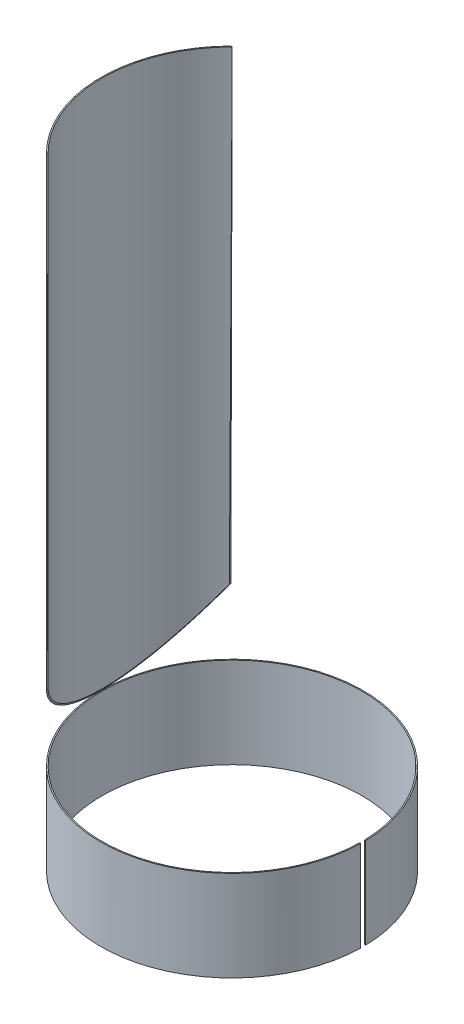
ISO-10303-21;
HEADER;
FILE_DESCRIPTION(('STEP AP214'),'2;1');
FILE_NAME('part.step','',(''),(''),'','','');
FILE_SCHEMA(('AUTOMOTIVE_DESIGN { 1 0 10303 214 1 1 1 1 }'));
ENDSEC;
DATA;
#1=APPLICATION_CONTEXT('core data for automotive mechanical design processes');
#2=APPLICATION_PROTOCOL_DEFINITION('international standard','automotive_design',2000,#1);
#3=PRODUCT_CONTEXT('',#1,'mechanical');
#4=PRODUCT('Part','Part','',(#3));
#5=PRODUCT_RELATED_PRODUCT_CATEGORY('part','',(#4));
#6=PRODUCT_DEFINITION_FORMATION('','',#4);
#7=PRODUCT_DEFINITION_CONTEXT('part definition',#1,'design');
#8=PRODUCT_DEFINITION('design','',#6,#7);
#9=PRODUCT_DEFINITION_SHAPE('','',#8);
#10=(LENGTH_UNIT() NAMED_UNIT(*) SI_UNIT(.MILLI.,.METRE.));
#11=(NAMED_UNIT(*) PLANE_ANGLE_UNIT() SI_UNIT($,.RADIAN.));
#12=(NAMED_UNIT(*) SI_UNIT($,.STERADIAN.) SOLID_ANGLE_UNIT());
#13=UNCERTAINTY_MEASURE_WITH_UNIT(LENGTH_MEASURE(1.E-05),#10,'distance_accuracy_value','');
#14=(GEOMETRIC_REPRESENTATION_CONTEXT(3) GLOBAL_UNCERTAINTY_ASSIGNED_CONTEXT((#13)) GLOBAL_UNIT_ASSIGNED_CONTEXT((#10,
#11,#12)) REPRESENTATION_CONTEXT('',''));
#15=CARTESIAN_POINT('',(0.,0.,0.));
#16=DIRECTION('',(0.,0.,1.));
#17=DIRECTION('',(1.,0.,0.));
#18=AXIS2_PLACEMENT_3D('',#15,#16,#17);
#19=CARTESIAN_POINT('',(0.,270.,0.));
#20=DIRECTION('',(0.,-1.,0.));
#21=DIRECTION('',(0.,0.,-1.));
#22=AXIS2_PLACEMENT_3D('',#19,#20,#21);
#23=CYLINDRICAL_SURFACE('',#22,56.5);
#24=CARTESIAN_POINT('',(0.,13327.2901506706,0.));
#25=DIRECTION('',(-0.999995330481393,0.00305598026980909,0.));
#26=DIRECTION('',(-0.00305598026980909,-0.999995330481393,0.));
#27=AXIS2_PLACEMENT_3D('',#24,#25,#26);
#28=ELLIPSE('',#27,18488.3392599683,56.5);
#29=CARTESIAN_POINT('',(-40.5206535567404,67.8902961925047,39.3741874244361));
#30=VERTEX_POINT('',#29);
#31=CARTESIAN_POINT('',(-39.9030074054575,270.,40.));
#32=VERTEX_POINT('',#31);
#33=EDGE_CURVE('E125',#30,#32,#28,.T.);
#34=ORIENTED_EDGE('',*,*,#33,.F.);
#35=CARTESIAN_POINT('',(0.,138.074126908676,0.));
#36=DIRECTION('',(-0.866025403784439,0.5,0.));
#37=DIRECTION('',(-0.5,-0.866025403784439,0.));
#38=AXIS2_PLACEMENT_3D('',#35,#36,#37);
#39=ELLIPSE('',#38,113.,56.5);
#40=CARTESIAN_POINT('',(-40.5206535567404,67.8902961925047,-39.3741874244361));
#41=VERTEX_POINT('',#40);
#42=EDGE_CURVE('E134',#41,#30,#39,.T.);
#43=ORIENTED_EDGE('',*,*,#42,.F.);
#44=CARTESIAN_POINT('',(-39.9030074054575,270.,-40.));
#45=VERTEX_POINT('',#44);
#46=EDGE_CURVE('E62',#45,#41,#28,.T.);
#47=ORIENTED_EDGE('',*,*,#46,.F.);
#48=CARTESIAN_POINT('',(0.,270.,0.));
#49=DIRECTION('',(0.,1.,0.));
#50=DIRECTION('',(0.,0.,1.));
#51=AXIS2_PLACEMENT_3D('',#48,#49,#50);
#52=CIRCLE('',#51,56.5);
#53=EDGE_CURVE('E132',#45,#32,#52,.T.);
#54=ORIENTED_EDGE('',*,*,#53,.T.);
#55=EDGE_LOOP('',(#34,#43,#47,#54));
#56=FACE_BOUND('',#55,.T.);
#57=ADVANCED_FACE('F39',(#56),#23,.F.);
#58=CARTESIAN_POINT('',(0.,270.,0.));
#59=DIRECTION('',(0.,-1.,0.));
#60=DIRECTION('',(0.,0.,-1.));
#61=AXIS2_PLACEMENT_3D('',#58,#59,#60);
#62=CYLINDRICAL_SURFACE('',#61,57.);
#63=CARTESIAN_POINT('',(0.,39.3472308772503,0.));
#64=DIRECTION('',(0.,-1.,0.));
#65=DIRECTION('',(0.,0.,-1.));
#66=AXIS2_PLACEMENT_3D('',#63,#64,#65);
#67=CIRCLE('',#66,57.);
#68=CARTESIAN_POINT('',(-56.8756928513772,39.3472308772503,-3.76238789544632));
#69=VERTEX_POINT('',#68);
#70=CARTESIAN_POINT('',(56.9894590845146,39.3472308772503,-1.09615384615384));
#71=VERTEX_POINT('',#70);
#72=EDGE_CURVE('E197',#69,#71,#67,.T.);
#73=ORIENTED_EDGE('',*,*,#72,.T.);
#74=DIRECTION('',(0.,-1.,0.));
#75=VECTOR('',#74,1.);
#76=CARTESIAN_POINT('',(56.9894590845146,270.,-1.09615384615384));
#77=LINE('',#76,#75);
#78=CARTESIAN_POINT('',(56.9894590845146,0.,-1.09615384615384));
#79=VERTEX_POINT('',#78);
#80=EDGE_CURVE('E150',#71,#79,#77,.T.);
#81=ORIENTED_EDGE('',*,*,#80,.T.);
#82=CARTESIAN_POINT('',(0.,0.,0.));
#83=DIRECTION('',(0.,1.,0.));
#84=DIRECTION('',(1.,0.,0.));
#85=AXIS2_PLACEMENT_3D('',#82,#83,#84);
#86=CIRCLE('',#85,57.);
#87=CARTESIAN_POINT('',(56.9894590845146,0.,1.09615384615386));
#88=VERTEX_POINT('',#87);
#89=EDGE_CURVE('E159',#79,#88,#86,.T.);
#90=ORIENTED_EDGE('',*,*,#89,.T.);
#91=DIRECTION('',(0.,-1.,0.));
#92=VECTOR('',#91,1.);
#93=CARTESIAN_POINT('',(56.9894590845146,270.,1.09615384615386));
#94=LINE('',#93,#92);
#95=CARTESIAN_POINT('',(56.9894590845146,39.3472308772503,1.09615384615385));
#96=VERTEX_POINT('',#95);
#97=EDGE_CURVE('E173',#96,#88,#94,.T.);
#98=ORIENTED_EDGE('',*,*,#97,.F.);
#99=CARTESIAN_POINT('',(-56.8756928513772,39.3472308772503,3.76238789544632));
#100=VERTEX_POINT('',#99);
#101=EDGE_CURVE('E194',#96,#100,#67,.T.);
#102=ORIENTED_EDGE('',*,*,#101,.T.);
#103=DIRECTION('',(0.,-1.,0.));
#104=VECTOR('',#103,1.);
#105=CARTESIAN_POINT('',(-56.8756928513772,270.,3.76238789544632));
#106=LINE('',#105,#104);
#107=CARTESIAN_POINT('',(-56.8756928513772,39.5625371744084,3.76238789544622));
#108=VERTEX_POINT('',#107);
#109=EDGE_CURVE('E177',#100,#108,#106,.F.);
#110=ORIENTED_EDGE('',*,*,#109,.T.);
#111=CARTESIAN_POINT('',(0.,138.074126908676,0.));
#112=DIRECTION('',(-0.866025403784439,0.5,0.));
#113=DIRECTION('',(-0.5,-0.866025403784439,0.));
#114=AXIS2_PLACEMENT_3D('',#111,#112,#113);
#115=ELLIPSE('',#114,114.,57.);
#116=CARTESIAN_POINT('',(-40.6078810084935,67.7392138142537,40.));
#117=VERTEX_POINT('',#116);
#118=EDGE_CURVE('E201',#108,#117,#115,.T.);
#119=ORIENTED_EDGE('',*,*,#118,.T.);
#120=DIRECTION('',(0.,-1.,0.));
#121=VECTOR('',#120,1.);
#122=CARTESIAN_POINT('',(-40.6078810084939,270.,40.));
#123=LINE('',#122,#121);
#124=CARTESIAN_POINT('',(-40.6078810084939,270.,40.));
#125=VERTEX_POINT('',#124);
#126=EDGE_CURVE('E192',#125,#117,#123,.T.);
#127=ORIENTED_EDGE('',*,*,#126,.F.);
#128=CARTESIAN_POINT('',(0.,270.,0.));
#129=DIRECTION('',(0.,1.,0.));
#130=DIRECTION('',(1.,0.,0.));
#131=AXIS2_PLACEMENT_3D('',#128,#129,#130);
#132=CIRCLE('',#131,57.);
#133=CARTESIAN_POINT('',(-40.6078810084939,270.,-40.));
#134=VERTEX_POINT('',#133);
#135=EDGE_CURVE('E151',#134,#125,#132,.T.);
#136=ORIENTED_EDGE('',*,*,#135,.F.);
#137=DIRECTION('',(0.,-1.,0.));
#138=VECTOR('',#137,1.);
#139=CARTESIAN_POINT('',(-40.6078810084939,270.,-40.));
#140=LINE('',#139,#138);
#141=CARTESIAN_POINT('',(-40.6078810084939,67.7392138142536,-40.));
#142=VERTEX_POINT('',#141);
#143=EDGE_CURVE('E141',#142,#134,#140,.F.);
#144=ORIENTED_EDGE('',*,*,#143,.F.);
#145=CARTESIAN_POINT('',(-56.8756928513772,39.5625371744084,-3.76238789544624));
#146=VERTEX_POINT('',#145);
#147=EDGE_CURVE('E202',#142,#146,#115,.T.);
#148=ORIENTED_EDGE('',*,*,#147,.T.);
#149=DIRECTION('',(0.,-1.,0.));
#150=VECTOR('',#149,1.);
#151=CARTESIAN_POINT('',(-56.8756928513772,270.,-3.76238789544632));
#152=LINE('',#151,#150);
#153=EDGE_CURVE('E179',#146,#69,#152,.T.);
#154=ORIENTED_EDGE('',*,*,#153,.T.);
#155=EDGE_LOOP('',(#73,#81,#90,#98,#102,#110,#119,#127,#136,#144,#148,#154));
#156=FACE_BOUND('',#155,.T.);
#157=ADVANCED_FACE('F41',(#156),#62,.T.);
#158=DIRECTION('',(0.,-1.,0.));
#159=VECTOR('',#158,1.);
#160=CARTESIAN_POINT('',(56.4895515486855,270.,-1.08653846153846));
#161=LINE('',#160,#159);
#162=CARTESIAN_POINT('',(56.4895515486855,39.3472308772503,-1.08653846153846));
#163=VERTEX_POINT('',#162);
#164=CARTESIAN_POINT('',(56.4895515486855,0.,-1.08653846153846));
#165=VERTEX_POINT('',#164);
#166=EDGE_CURVE('E153',#163,#165,#161,.T.);
#167=ORIENTED_EDGE('',*,*,#166,.F.);
#168=CARTESIAN_POINT('',(0.,39.3472308772503,0.));
#169=DIRECTION('',(0.,-1.,0.));
#170=DIRECTION('',(0.,0.,-1.));
#171=AXIS2_PLACEMENT_3D('',#168,#169,#170);
#172=CIRCLE('',#171,56.5);
#173=CARTESIAN_POINT('',(56.4895515486855,39.3472308772503,1.08653846153846));
#174=VERTEX_POINT('',#173);
#175=EDGE_CURVE('E145',#174,#163,#172,.T.);
#176=ORIENTED_EDGE('',*,*,#175,.F.);
#177=DIRECTION('',(0.,-1.,0.));
#178=VECTOR('',#177,1.);
#179=CARTESIAN_POINT('',(56.4895515486855,270.,1.08653846153846));
#180=LINE('',#179,#178);
#181=CARTESIAN_POINT('',(56.4895515486855,0.,1.08653846153846));
#182=VERTEX_POINT('',#181);
#183=EDGE_CURVE('E171',#174,#182,#180,.T.);
#184=ORIENTED_EDGE('',*,*,#183,.T.);
#185=CARTESIAN_POINT('',(0.,0.,0.));
#186=DIRECTION('',(0.,1.,0.));
#187=DIRECTION('',(0.,0.,1.));
#188=AXIS2_PLACEMENT_3D('',#185,#186,#187);
#189=CIRCLE('',#188,56.5);
#190=EDGE_CURVE('E165',#165,#182,#189,.T.);
#191=ORIENTED_EDGE('',*,*,#190,.F.);
#192=EDGE_LOOP('',(#167,#176,#184,#191));
#193=FACE_BOUND('',#192,.T.);
#194=ADVANCED_FACE('F228',(#193),#23,.F.);
#195=CARTESIAN_POINT('',(0.,270.,0.));
#196=DIRECTION('',(0.,1.,0.));
#197=DIRECTION('',(1.,0.,0.));
#198=AXIS2_PLACEMENT_3D('',#195,#196,#197);
#199=PLANE('',#198);
#200=ORIENTED_EDGE('',*,*,#53,.F.);
#201=DIRECTION('',(-1.,0.,0.));
#202=VECTOR('',#201,1.);
#203=CARTESIAN_POINT('',(0.,270.,-40.));
#204=LINE('',#203,#202);
#205=EDGE_CURVE('E138',#45,#134,#204,.T.);
#206=ORIENTED_EDGE('',*,*,#205,.T.);
#207=ORIENTED_EDGE('',*,*,#135,.T.);
#208=DIRECTION('',(1.,0.,0.));
#209=VECTOR('',#208,1.);
#210=CARTESIAN_POINT('',(0.,270.,40.));
#211=LINE('',#210,#209);
#212=EDGE_CURVE('E146',#125,#32,#211,.T.);
#213=ORIENTED_EDGE('',*,*,#212,.T.);
#214=EDGE_LOOP('',(#200,#206,#207,#213));
#215=FACE_BOUND('',#214,.T.);
#216=ADVANCED_FACE('F149',(#215),#199,.T.);
#217=CARTESIAN_POINT('',(56.4895515486855,270.,1.08653846153846));
#218=DIRECTION('',(0.0192307692307904,0.,-0.99981507165815));
#219=DIRECTION('',(-0.99981507165815,0.,-0.0192307692307904));
#220=AXIS2_PLACEMENT_3D('',#217,#218,#219);
#221=PLANE('',#220);
#222=DIRECTION('',(-0.99981507165815,0.,-0.0192307692307904));
#223=VECTOR('',#222,1.);
#224=CARTESIAN_POINT('',(56.4895515486855,39.3472308772503,1.08653846153846));
#225=LINE('',#224,#223);
#226=EDGE_CURVE('E209',#96,#174,#225,.T.);
#227=ORIENTED_EDGE('',*,*,#226,.F.);
#228=ORIENTED_EDGE('',*,*,#97,.T.);
#229=DIRECTION('',(0.99981507165815,0.,0.0192307692307904));
#230=VECTOR('',#229,1.);
#231=CARTESIAN_POINT('',(56.4895515486855,0.,1.08653846153846));
#232=LINE('',#231,#230);
#233=EDGE_CURVE('E162',#182,#88,#232,.T.);
#234=ORIENTED_EDGE('',*,*,#233,.F.);
#235=ORIENTED_EDGE('',*,*,#183,.F.);
#236=EDGE_LOOP('',(#227,#228,#234,#235));
#237=FACE_BOUND('',#236,.T.);
#238=ADVANCED_FACE('F238',(#237),#221,.T.);
#239=CARTESIAN_POINT('',(56.9894590845146,270.,-1.09615384615384));
#240=DIRECTION('',(0.0192307692307692,0.,0.999815071658151));
#241=DIRECTION('',(0.999815071658151,0.,-0.0192307692307692));
#242=AXIS2_PLACEMENT_3D('',#239,#240,#241);
#243=PLANE('',#242);
#244=DIRECTION('',(0.999815071658151,0.,-0.0192307692307692));
#245=VECTOR('',#244,1.);
#246=CARTESIAN_POINT('',(56.9894590845146,39.3472308772503,-1.09615384615384));
#247=LINE('',#246,#245);
#248=EDGE_CURVE('E135',#163,#71,#247,.T.);
#249=ORIENTED_EDGE('',*,*,#248,.F.);
#250=ORIENTED_EDGE('',*,*,#166,.T.);
#251=DIRECTION('',(-0.999815071658151,0.,0.0192307692307692));
#252=VECTOR('',#251,1.);
#253=CARTESIAN_POINT('',(56.9894590845146,0.,-1.09615384615384));
#254=LINE('',#253,#252);
#255=EDGE_CURVE('E155',#79,#165,#254,.T.);
#256=ORIENTED_EDGE('',*,*,#255,.F.);
#257=ORIENTED_EDGE('',*,*,#80,.F.);
#258=EDGE_LOOP('',(#249,#250,#256,#257));
#259=FACE_BOUND('',#258,.T.);
#260=ADVANCED_FACE('F245',(#259),#243,.T.);
#261=CARTESIAN_POINT('',(0.,0.,0.));
#262=DIRECTION('',(0.,1.,0.));
#263=DIRECTION('',(1.,0.,0.));
#264=AXIS2_PLACEMENT_3D('',#261,#262,#263);
#265=PLANE('',#264);
#266=ORIENTED_EDGE('',*,*,#89,.F.);
#267=ORIENTED_EDGE('',*,*,#255,.T.);
#268=ORIENTED_EDGE('',*,*,#190,.T.);
#269=ORIENTED_EDGE('',*,*,#233,.T.);
#270=EDGE_LOOP('',(#266,#267,#268,#269));
#271=FACE_BOUND('',#270,.T.);
#272=ADVANCED_FACE('F256',(#271),#265,.F.);
#273=CARTESIAN_POINT('',(-294.579475902826,167.847507777969,40.));
#274=DIRECTION('',(0.,0.,1.));
#275=DIRECTION('',(1.,0.,0.));
#276=AXIS2_PLACEMENT_3D('',#273,#274,#275);
#277=PLANE('',#276);
#278=DIRECTION('',(-0.00305598026980909,-0.999995330481393,0.));
#279=VECTOR('',#278,1.);
#280=CARTESIAN_POINT('',(-40.217560375952,167.070179152978,40.));
#281=LINE('',#280,#279);
#282=CARTESIAN_POINT('',(-40.5206535567407,67.8902961925049,40.));
#283=VERTEX_POINT('',#282);
#284=EDGE_CURVE('E54',#32,#283,#281,.T.);
#285=ORIENTED_EDGE('',*,*,#284,.F.);
#286=ORIENTED_EDGE('',*,*,#212,.F.);
#287=ORIENTED_EDGE('',*,*,#126,.T.);
#288=DIRECTION('',(-0.500000000000001,-0.866025403784438,0.));
#289=VECTOR('',#288,1.);
#290=CARTESIAN_POINT('',(-60.7526168810281,32.8475077779691,40.));
#291=LINE('',#290,#289);
#292=EDGE_CURVE('E186',#283,#117,#291,.T.);
#293=ORIENTED_EDGE('',*,*,#292,.F.);
#294=EDGE_LOOP('',(#285,#286,#287,#293));
#295=FACE_BOUND('',#294,.T.);
#296=ADVANCED_FACE('F190',(#295),#277,.T.);
#297=CARTESIAN_POINT('',(-129.412202087701,453.925617773407,-40.));
#298=DIRECTION('',(0.,0.,-1.));
#299=DIRECTION('',(-1.,0.,0.));
#300=AXIS2_PLACEMENT_3D('',#297,#298,#299);
#301=PLANE('',#300);
#302=DIRECTION('',(0.00305598026980909,0.999995330481393,0.));
#303=VECTOR('',#302,1.);
#304=CARTESIAN_POINT('',(-39.3417728987886,453.650363033605,-40.));
#305=LINE('',#304,#303);
#306=CARTESIAN_POINT('',(-40.5206535567404,67.8902961925047,-40.));
#307=VERTEX_POINT('',#306);
#308=EDGE_CURVE('E119',#307,#45,#305,.T.);
#309=ORIENTED_EDGE('',*,*,#308,.F.);
#310=DIRECTION('',(0.500000000000001,0.866025403784438,0.));
#311=VECTOR('',#310,1.);
#312=CARTESIAN_POINT('',(104.414656934098,318.925617773407,-40.));
#313=LINE('',#312,#311);
#314=EDGE_CURVE('E193',#142,#307,#313,.T.);
#315=ORIENTED_EDGE('',*,*,#314,.F.);
#316=ORIENTED_EDGE('',*,*,#143,.T.);
#317=ORIENTED_EDGE('',*,*,#205,.F.);
#318=EDGE_LOOP('',(#309,#315,#316,#317));
#319=FACE_BOUND('',#318,.T.);
#320=ADVANCED_FACE('F139',(#319),#301,.T.);
#321=CARTESIAN_POINT('',(-56.8756928513772,39.3472308772503,-57.));
#322=DIRECTION('',(-1.,0.,0.));
#323=DIRECTION('',(0.,0.,1.));
#324=AXIS2_PLACEMENT_3D('',#321,#322,#323);
#325=PLANE('',#324);
#326=DIRECTION('',(0.,0.,1.));
#327=VECTOR('',#326,1.);
#328=CARTESIAN_POINT('',(-56.8756928513772,39.5625371744084,-57.));
#329=LINE('',#328,#327);
#330=EDGE_CURVE('E206',#146,#108,#329,.T.);
#331=ORIENTED_EDGE('',*,*,#330,.T.);
#332=ORIENTED_EDGE('',*,*,#109,.F.);
#333=DIRECTION('',(0.,0.,1.));
#334=VECTOR('',#333,1.);
#335=CARTESIAN_POINT('',(-56.8756928513772,39.3472308772503,-57.));
#336=LINE('',#335,#334);
#337=EDGE_CURVE('E205',#69,#100,#336,.T.);
#338=ORIENTED_EDGE('',*,*,#337,.F.);
#339=ORIENTED_EDGE('',*,*,#153,.F.);
#340=EDGE_LOOP('',(#331,#332,#338,#339));
#341=FACE_BOUND('',#340,.T.);
#342=ADVANCED_FACE('F259',(#341),#325,.F.);
#343=CARTESIAN_POINT('',(10.,39.3472308772503,-57.));
#344=DIRECTION('',(0.,-1.,0.));
#345=DIRECTION('',(0.,0.,-1.));
#346=AXIS2_PLACEMENT_3D('',#343,#344,#345);
#347=PLANE('',#346);
#348=ORIENTED_EDGE('',*,*,#337,.T.);
#349=ORIENTED_EDGE('',*,*,#101,.F.);
#350=ORIENTED_EDGE('',*,*,#226,.T.);
#351=ORIENTED_EDGE('',*,*,#175,.T.);
#352=ORIENTED_EDGE('',*,*,#248,.T.);
#353=ORIENTED_EDGE('',*,*,#72,.F.);
#354=EDGE_LOOP('',(#348,#349,#350,#351,#352,#353));
#355=FACE_BOUND('',#354,.T.);
#356=ADVANCED_FACE('F223',(#355),#347,.F.);
#357=CARTESIAN_POINT('',(-56.8756928513772,39.5625371744084,-57.));
#358=DIRECTION('',(-0.866025403784439,0.5,0.));
#359=DIRECTION('',(-0.5,-0.866025403784439,0.));
#360=AXIS2_PLACEMENT_3D('',#357,#358,#359);
#361=PLANE('',#360);
#362=ORIENTED_EDGE('',*,*,#314,.T.);
#363=DIRECTION('',(0.,0.,1.));
#364=VECTOR('',#363,1.);
#365=CARTESIAN_POINT('',(-40.5206535567404,67.8902961925047,-57.));
#366=LINE('',#365,#364);
#367=EDGE_CURVE('E11',#307,#41,#366,.T.);
#368=ORIENTED_EDGE('',*,*,#367,.T.);
#369=ORIENTED_EDGE('',*,*,#42,.T.);
#370=EDGE_CURVE('E43',#30,#283,#366,.T.);
#371=ORIENTED_EDGE('',*,*,#370,.T.);
#372=ORIENTED_EDGE('',*,*,#292,.T.);
#373=ORIENTED_EDGE('',*,*,#118,.F.);
#374=ORIENTED_EDGE('',*,*,#330,.F.);
#375=ORIENTED_EDGE('',*,*,#147,.F.);
#376=EDGE_LOOP('',(#362,#368,#369,#371,#372,#373,#374,#375));
#377=FACE_BOUND('',#376,.T.);
#378=ADVANCED_FACE('F185',(#377),#361,.F.);
#379=CARTESIAN_POINT('',(-40.6078810084939,39.3472308772503,-57.));
#380=DIRECTION('',(-0.999995330481393,0.00305598026980909,0.));
#381=DIRECTION('',(-0.00305598026980909,-0.999995330481393,0.));
#382=AXIS2_PLACEMENT_3D('',#379,#380,#381);
#383=PLANE('',#382);
#384=ORIENTED_EDGE('',*,*,#33,.T.);
#385=ORIENTED_EDGE('',*,*,#284,.T.);
#386=ORIENTED_EDGE('',*,*,#370,.F.);
#387=EDGE_LOOP('',(#384,#385,#386));
#388=FACE_BOUND('',#387,.T.);
#389=ADVANCED_FACE('F216',(#388),#383,.F.);
#390=ORIENTED_EDGE('',*,*,#46,.T.);
#391=ORIENTED_EDGE('',*,*,#367,.F.);
#392=ORIENTED_EDGE('',*,*,#308,.T.);
#393=EDGE_LOOP('',(#390,#391,#392));
#394=FACE_BOUND('',#393,.T.);
#395=ADVANCED_FACE('F120',(#394),#383,.F.);
#396=CLOSED_SHELL('',(#57,#157,#194,#216,#238,#260,#272,#296,#320,#342,#356,#378,#389,#395));
#397=MANIFOLD_SOLID_BREP('B2',#396);
#398=ADVANCED_BREP_SHAPE_REPRESENTATION('',(#18,#397),#14);
#399=SHAPE_DEFINITION_REPRESENTATION(#9,#398);
ENDSEC;
END-ISO-10303-21;
